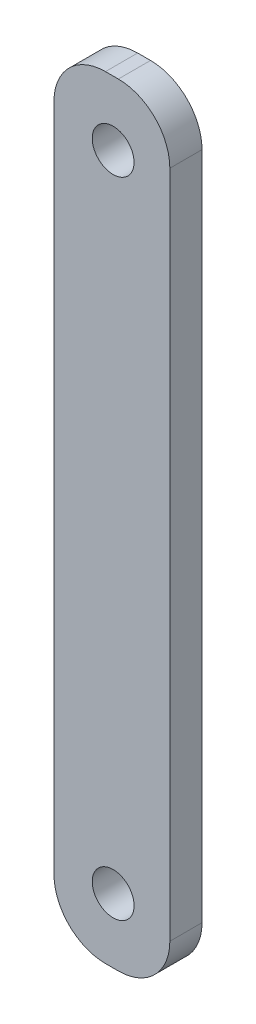
ISO-10303-21;
HEADER;
FILE_DESCRIPTION(('STEP AP214'),'2;1');
FILE_NAME('part.step','',(''),(''),'','','');
FILE_SCHEMA(('AUTOMOTIVE_DESIGN { 1 0 10303 214 1 1 1 1 }'));
ENDSEC;
DATA;
#1=APPLICATION_CONTEXT('core data for automotive mechanical design processes');
#2=APPLICATION_PROTOCOL_DEFINITION('international standard','automotive_design',2000,#1);
#3=PRODUCT_CONTEXT('',#1,'mechanical');
#4=PRODUCT('Part','Part','',(#3));
#5=PRODUCT_RELATED_PRODUCT_CATEGORY('part','',(#4));
#6=PRODUCT_DEFINITION_FORMATION('','',#4);
#7=PRODUCT_DEFINITION_CONTEXT('part definition',#1,'design');
#8=PRODUCT_DEFINITION('design','',#6,#7);
#9=PRODUCT_DEFINITION_SHAPE('','',#8);
#10=(LENGTH_UNIT() NAMED_UNIT(*) SI_UNIT(.MILLI.,.METRE.));
#11=(NAMED_UNIT(*) PLANE_ANGLE_UNIT() SI_UNIT($,.RADIAN.));
#12=(NAMED_UNIT(*) SI_UNIT($,.STERADIAN.) SOLID_ANGLE_UNIT());
#13=UNCERTAINTY_MEASURE_WITH_UNIT(LENGTH_MEASURE(1.E-05),#10,'distance_accuracy_value','');
#14=(GEOMETRIC_REPRESENTATION_CONTEXT(3) GLOBAL_UNCERTAINTY_ASSIGNED_CONTEXT((#13)) GLOBAL_UNIT_ASSIGNED_CONTEXT((#10,
#11,#12)) REPRESENTATION_CONTEXT('',''));
#15=CARTESIAN_POINT('',(0.,0.,0.));
#16=DIRECTION('',(0.,0.,1.));
#17=DIRECTION('',(1.,0.,0.));
#18=AXIS2_PLACEMENT_3D('',#15,#16,#17);
#19=CARTESIAN_POINT('',(-9.19325153374236,110.955788215749,5.));
#20=DIRECTION('',(0.,1.,0.));
#21=DIRECTION('',(0.,0.,1.));
#22=AXIS2_PLACEMENT_3D('',#19,#20,#21);
#23=PLANE('',#22);
#24=DIRECTION('',(1.,0.,0.));
#25=VECTOR('',#24,1.);
#26=CARTESIAN_POINT('',(-9.19325153374236,110.955788215749,0.));
#27=LINE('',#26,#25);
#28=CARTESIAN_POINT('',(-1.19325153374236,110.955788215749,0.));
#29=VERTEX_POINT('',#28);
#30=CARTESIAN_POINT('',(0.806748466257638,110.955788215749,0.));
#31=VERTEX_POINT('',#30);
#32=EDGE_CURVE('E135',#29,#31,#27,.T.);
#33=ORIENTED_EDGE('',*,*,#32,.F.);
#34=DIRECTION('',(0.,0.,-1.));
#35=VECTOR('',#34,1.);
#36=CARTESIAN_POINT('',(-1.19325153374236,110.955788215749,5.));
#37=LINE('',#36,#35);
#38=CARTESIAN_POINT('',(-1.19325153374236,110.955788215749,5.));
#39=VERTEX_POINT('',#38);
#40=EDGE_CURVE('E11',#29,#39,#37,.F.);
#41=ORIENTED_EDGE('',*,*,#40,.T.);
#42=DIRECTION('',(1.,0.,0.));
#43=VECTOR('',#42,1.);
#44=CARTESIAN_POINT('',(-9.19325153374236,110.955788215749,5.));
#45=LINE('',#44,#43);
#46=CARTESIAN_POINT('',(0.806748466257638,110.955788215749,5.));
#47=VERTEX_POINT('',#46);
#48=EDGE_CURVE('E133',#39,#47,#45,.T.);
#49=ORIENTED_EDGE('',*,*,#48,.T.);
#50=DIRECTION('',(0.,0.,-1.));
#51=VECTOR('',#50,1.);
#52=CARTESIAN_POINT('',(0.806748466257638,110.955788215749,5.));
#53=LINE('',#52,#51);
#54=EDGE_CURVE('E47',#47,#31,#53,.T.);
#55=ORIENTED_EDGE('',*,*,#54,.T.);
#56=EDGE_LOOP('',(#33,#41,#49,#55));
#57=FACE_BOUND('',#56,.T.);
#58=ADVANCED_FACE('F39',(#57),#23,.T.);
#59=CARTESIAN_POINT('',(-9.19325153374236,110.955788215749,5.));
#60=DIRECTION('',(1.,0.,0.));
#61=DIRECTION('',(0.,1.,0.));
#62=AXIS2_PLACEMENT_3D('',#59,#60,#61);
#63=PLANE('',#62);
#64=DIRECTION('',(0.,-1.,0.));
#65=VECTOR('',#64,1.);
#66=CARTESIAN_POINT('',(-9.19325153374236,110.955788215749,0.));
#67=LINE('',#66,#65);
#68=CARTESIAN_POINT('',(-9.19325153374236,102.955788215749,0.));
#69=VERTEX_POINT('',#68);
#70=CARTESIAN_POINT('',(-9.19325153374235,-1.04421178425126,0.));
#71=VERTEX_POINT('',#70);
#72=EDGE_CURVE('E130',#69,#71,#67,.T.);
#73=ORIENTED_EDGE('',*,*,#72,.T.);
#74=DIRECTION('',(0.,0.,-1.));
#75=VECTOR('',#74,1.);
#76=CARTESIAN_POINT('',(-9.19325153374235,-1.04421178425126,5.));
#77=LINE('',#76,#75);
#78=CARTESIAN_POINT('',(-9.19325153374235,-1.04421178425126,5.));
#79=VERTEX_POINT('',#78);
#80=EDGE_CURVE('E110',#71,#79,#77,.F.);
#81=ORIENTED_EDGE('',*,*,#80,.T.);
#82=DIRECTION('',(0.,-1.,0.));
#83=VECTOR('',#82,1.);
#84=CARTESIAN_POINT('',(-9.19325153374236,110.955788215749,5.));
#85=LINE('',#84,#83);
#86=CARTESIAN_POINT('',(-9.19325153374236,102.955788215749,5.));
#87=VERTEX_POINT('',#86);
#88=EDGE_CURVE('E146',#87,#79,#85,.T.);
#89=ORIENTED_EDGE('',*,*,#88,.F.);
#90=DIRECTION('',(0.,0.,-1.));
#91=VECTOR('',#90,1.);
#92=CARTESIAN_POINT('',(-9.19325153374236,102.955788215749,0.));
#93=LINE('',#92,#91);
#94=EDGE_CURVE('E115',#87,#69,#93,.T.);
#95=ORIENTED_EDGE('',*,*,#94,.T.);
#96=EDGE_LOOP('',(#73,#81,#89,#95));
#97=FACE_BOUND('',#96,.T.);
#98=ADVANCED_FACE('F200',(#97),#63,.F.);
#99=CARTESIAN_POINT('',(-9.19325153374235,-9.04421178425126,5.));
#100=DIRECTION('',(0.,1.,0.));
#101=DIRECTION('',(0.,0.,1.));
#102=AXIS2_PLACEMENT_3D('',#99,#100,#101);
#103=PLANE('',#102);
#104=DIRECTION('',(1.,0.,0.));
#105=VECTOR('',#104,1.);
#106=CARTESIAN_POINT('',(-9.19325153374235,-9.04421178425126,5.));
#107=LINE('',#106,#105);
#108=CARTESIAN_POINT('',(-1.19325153374235,-9.04421178425126,5.));
#109=VERTEX_POINT('',#108);
#110=CARTESIAN_POINT('',(0.806748466257652,-9.04421178425126,5.));
#111=VERTEX_POINT('',#110);
#112=EDGE_CURVE('E124',#109,#111,#107,.T.);
#113=ORIENTED_EDGE('',*,*,#112,.F.);
#114=DIRECTION('',(0.,0.,-1.));
#115=VECTOR('',#114,1.);
#116=CARTESIAN_POINT('',(-1.19325153374235,-9.04421178425126,5.));
#117=LINE('',#116,#115);
#118=CARTESIAN_POINT('',(-1.19325153374235,-9.04421178425126,0.));
#119=VERTEX_POINT('',#118);
#120=EDGE_CURVE('E109',#109,#119,#117,.T.);
#121=ORIENTED_EDGE('',*,*,#120,.T.);
#122=DIRECTION('',(1.,0.,0.));
#123=VECTOR('',#122,1.);
#124=CARTESIAN_POINT('',(-9.19325153374235,-9.04421178425126,0.));
#125=LINE('',#124,#123);
#126=CARTESIAN_POINT('',(0.806748466257652,-9.04421178425126,0.));
#127=VERTEX_POINT('',#126);
#128=EDGE_CURVE('E122',#119,#127,#125,.T.);
#129=ORIENTED_EDGE('',*,*,#128,.T.);
#130=DIRECTION('',(0.,0.,-1.));
#131=VECTOR('',#130,1.);
#132=CARTESIAN_POINT('',(0.806748466257652,-9.04421178425126,5.));
#133=LINE('',#132,#131);
#134=EDGE_CURVE('E126',#127,#111,#133,.F.);
#135=ORIENTED_EDGE('',*,*,#134,.T.);
#136=EDGE_LOOP('',(#113,#121,#129,#135));
#137=FACE_BOUND('',#136,.T.);
#138=ADVANCED_FACE('F121',(#137),#103,.F.);
#139=CARTESIAN_POINT('',(8.80674846625764,110.955788215749,5.));
#140=DIRECTION('',(1.,0.,0.));
#141=DIRECTION('',(0.,1.,0.));
#142=AXIS2_PLACEMENT_3D('',#139,#140,#141);
#143=PLANE('',#142);
#144=DIRECTION('',(0.,-1.,0.));
#145=VECTOR('',#144,1.);
#146=CARTESIAN_POINT('',(8.80674846625764,110.955788215749,5.));
#147=LINE('',#146,#145);
#148=CARTESIAN_POINT('',(8.80674846625764,102.955788215749,5.));
#149=VERTEX_POINT('',#148);
#150=CARTESIAN_POINT('',(8.80674846625765,-1.04421178425125,5.));
#151=VERTEX_POINT('',#150);
#152=EDGE_CURVE('E179',#149,#151,#147,.T.);
#153=ORIENTED_EDGE('',*,*,#152,.T.);
#154=DIRECTION('',(0.,0.,-1.));
#155=VECTOR('',#154,1.);
#156=CARTESIAN_POINT('',(8.80674846625765,-1.04421178425125,0.));
#157=LINE('',#156,#155);
#158=CARTESIAN_POINT('',(8.80674846625765,-1.04421178425125,0.));
#159=VERTEX_POINT('',#158);
#160=EDGE_CURVE('E163',#151,#159,#157,.T.);
#161=ORIENTED_EDGE('',*,*,#160,.T.);
#162=DIRECTION('',(0.,-1.,0.));
#163=VECTOR('',#162,1.);
#164=CARTESIAN_POINT('',(8.80674846625764,110.955788215749,0.));
#165=LINE('',#164,#163);
#166=CARTESIAN_POINT('',(8.80674846625764,102.955788215749,0.));
#167=VERTEX_POINT('',#166);
#168=EDGE_CURVE('E131',#167,#159,#165,.T.);
#169=ORIENTED_EDGE('',*,*,#168,.F.);
#170=DIRECTION('',(0.,0.,-1.));
#171=VECTOR('',#170,1.);
#172=CARTESIAN_POINT('',(8.80674846625764,102.955788215749,5.));
#173=LINE('',#172,#171);
#174=EDGE_CURVE('E61',#167,#149,#173,.F.);
#175=ORIENTED_EDGE('',*,*,#174,.T.);
#176=EDGE_LOOP('',(#153,#161,#169,#175));
#177=FACE_BOUND('',#176,.T.);
#178=ADVANCED_FACE('F193',(#177),#143,.T.);
#179=CARTESIAN_POINT('',(0.,0.,5.));
#180=DIRECTION('',(0.,0.,-1.));
#181=DIRECTION('',(-1.,0.,0.));
#182=AXIS2_PLACEMENT_3D('',#179,#180,#181);
#183=PLANE('',#182);
#184=CARTESIAN_POINT('',(0.,0.955788215748743,5.));
#185=DIRECTION('',(0.,0.,1.));
#186=DIRECTION('',(1.,0.,0.));
#187=AXIS2_PLACEMENT_3D('',#184,#185,#186);
#188=CIRCLE('',#187,3.25);
#189=CARTESIAN_POINT('',(3.25,0.955788215748743,5.));
#190=VERTEX_POINT('',#189);
#191=EDGE_CURVE('E143',#190,#190,#188,.T.);
#192=ORIENTED_EDGE('',*,*,#191,.F.);
#193=EDGE_LOOP('',(#192));
#194=FACE_BOUND('',#193,.T.);
#195=CARTESIAN_POINT('',(0.,100.955788215749,5.));
#196=DIRECTION('',(0.,0.,1.));
#197=DIRECTION('',(1.,0.,0.));
#198=AXIS2_PLACEMENT_3D('',#195,#196,#197);
#199=CIRCLE('',#198,3.25);
#200=CARTESIAN_POINT('',(3.25,100.955788215749,5.));
#201=VERTEX_POINT('',#200);
#202=EDGE_CURVE('E182',#201,#201,#199,.T.);
#203=ORIENTED_EDGE('',*,*,#202,.F.);
#204=EDGE_LOOP('',(#203));
#205=FACE_BOUND('',#204,.T.);
#206=ORIENTED_EDGE('',*,*,#88,.T.);
#207=CARTESIAN_POINT('',(-1.19325153374235,-1.04421178425126,5.));
#208=DIRECTION('',(0.,0.,-1.));
#209=DIRECTION('',(-1.,0.,0.));
#210=AXIS2_PLACEMENT_3D('',#207,#208,#209);
#211=CIRCLE('',#210,8.);
#212=EDGE_CURVE('E160',#79,#109,#211,.F.);
#213=ORIENTED_EDGE('',*,*,#212,.T.);
#214=ORIENTED_EDGE('',*,*,#112,.T.);
#215=CARTESIAN_POINT('',(0.806748466257652,-1.04421178425125,5.));
#216=DIRECTION('',(0.,0.,-1.));
#217=DIRECTION('',(-1.,0.,0.));
#218=AXIS2_PLACEMENT_3D('',#215,#216,#217);
#219=CIRCLE('',#218,8.);
#220=EDGE_CURVE('E54',#111,#151,#219,.F.);
#221=ORIENTED_EDGE('',*,*,#220,.T.);
#222=ORIENTED_EDGE('',*,*,#152,.F.);
#223=CARTESIAN_POINT('',(0.806748466257638,102.955788215749,5.));
#224=DIRECTION('',(0.,0.,-1.));
#225=DIRECTION('',(-1.,0.,0.));
#226=AXIS2_PLACEMENT_3D('',#223,#224,#225);
#227=CIRCLE('',#226,8.);
#228=EDGE_CURVE('E155',#149,#47,#227,.F.);
#229=ORIENTED_EDGE('',*,*,#228,.T.);
#230=ORIENTED_EDGE('',*,*,#48,.F.);
#231=CARTESIAN_POINT('',(-1.19325153374236,102.955788215749,5.));
#232=DIRECTION('',(0.,0.,-1.));
#233=DIRECTION('',(-1.,0.,0.));
#234=AXIS2_PLACEMENT_3D('',#231,#232,#233);
#235=CIRCLE('',#234,8.);
#236=EDGE_CURVE('E157',#39,#87,#235,.F.);
#237=ORIENTED_EDGE('',*,*,#236,.T.);
#238=EDGE_LOOP('',(#206,#213,#214,#221,#222,#229,#230,#237));
#239=FACE_BOUND('',#238,.T.);
#240=ADVANCED_FACE('F190',(#194,#205,#239),#183,.F.);
#241=CARTESIAN_POINT('',(0.,0.,0.));
#242=DIRECTION('',(0.,0.,-1.));
#243=DIRECTION('',(-1.,0.,0.));
#244=AXIS2_PLACEMENT_3D('',#241,#242,#243);
#245=PLANE('',#244);
#246=CARTESIAN_POINT('',(0.,0.955788215748743,0.));
#247=DIRECTION('',(0.,0.,-1.));
#248=DIRECTION('',(-1.,0.,0.));
#249=AXIS2_PLACEMENT_3D('',#246,#247,#248);
#250=CIRCLE('',#249,3.25);
#251=CARTESIAN_POINT('',(-3.25,0.955788215748743,0.));
#252=VERTEX_POINT('',#251);
#253=EDGE_CURVE('E142',#252,#252,#250,.T.);
#254=ORIENTED_EDGE('',*,*,#253,.F.);
#255=EDGE_LOOP('',(#254));
#256=FACE_BOUND('',#255,.T.);
#257=CARTESIAN_POINT('',(0.,100.955788215749,0.));
#258=DIRECTION('',(0.,0.,-1.));
#259=DIRECTION('',(-1.,0.,0.));
#260=AXIS2_PLACEMENT_3D('',#257,#258,#259);
#261=CIRCLE('',#260,3.25);
#262=CARTESIAN_POINT('',(-3.25,100.955788215749,0.));
#263=VERTEX_POINT('',#262);
#264=EDGE_CURVE('E139',#263,#263,#261,.T.);
#265=ORIENTED_EDGE('',*,*,#264,.F.);
#266=EDGE_LOOP('',(#265));
#267=FACE_BOUND('',#266,.T.);
#268=ORIENTED_EDGE('',*,*,#128,.F.);
#269=CARTESIAN_POINT('',(-1.19325153374235,-1.04421178425126,0.));
#270=DIRECTION('',(0.,0.,-1.));
#271=DIRECTION('',(-1.,0.,0.));
#272=AXIS2_PLACEMENT_3D('',#269,#270,#271);
#273=CIRCLE('',#272,8.);
#274=EDGE_CURVE('E105',#119,#71,#273,.T.);
#275=ORIENTED_EDGE('',*,*,#274,.T.);
#276=ORIENTED_EDGE('',*,*,#72,.F.);
#277=CARTESIAN_POINT('',(-1.19325153374236,102.955788215749,0.));
#278=DIRECTION('',(0.,0.,-1.));
#279=DIRECTION('',(-1.,0.,0.));
#280=AXIS2_PLACEMENT_3D('',#277,#278,#279);
#281=CIRCLE('',#280,8.);
#282=EDGE_CURVE('E149',#69,#29,#281,.T.);
#283=ORIENTED_EDGE('',*,*,#282,.T.);
#284=ORIENTED_EDGE('',*,*,#32,.T.);
#285=CARTESIAN_POINT('',(0.806748466257638,102.955788215749,0.));
#286=DIRECTION('',(0.,0.,-1.));
#287=DIRECTION('',(-1.,0.,0.));
#288=AXIS2_PLACEMENT_3D('',#285,#286,#287);
#289=CIRCLE('',#288,8.);
#290=EDGE_CURVE('E125',#31,#167,#289,.T.);
#291=ORIENTED_EDGE('',*,*,#290,.T.);
#292=ORIENTED_EDGE('',*,*,#168,.T.);
#293=CARTESIAN_POINT('',(0.806748466257652,-1.04421178425125,0.));
#294=DIRECTION('',(0.,0.,-1.));
#295=DIRECTION('',(-1.,0.,0.));
#296=AXIS2_PLACEMENT_3D('',#293,#294,#295);
#297=CIRCLE('',#296,8.);
#298=EDGE_CURVE('E116',#159,#127,#297,.T.);
#299=ORIENTED_EDGE('',*,*,#298,.T.);
#300=EDGE_LOOP('',(#268,#275,#276,#283,#284,#291,#292,#299));
#301=FACE_BOUND('',#300,.T.);
#302=ADVANCED_FACE('F128',(#256,#267,#301),#245,.T.);
#303=CARTESIAN_POINT('',(0.,100.955788215749,-25.));
#304=DIRECTION('',(0.,0.,1.));
#305=DIRECTION('',(1.,0.,0.));
#306=AXIS2_PLACEMENT_3D('',#303,#304,#305);
#307=CYLINDRICAL_SURFACE('',#306,3.25);
#308=ORIENTED_EDGE('',*,*,#264,.T.);
#309=EDGE_LOOP('',(#308));
#310=FACE_BOUND('',#309,.T.);
#311=ORIENTED_EDGE('',*,*,#202,.T.);
#312=EDGE_LOOP('',(#311));
#313=FACE_BOUND('',#312,.T.);
#314=ADVANCED_FACE('F233',(#310,#313),#307,.F.);
#315=CARTESIAN_POINT('',(0.,0.955788215748743,-25.));
#316=DIRECTION('',(0.,0.,1.));
#317=DIRECTION('',(1.,0.,0.));
#318=AXIS2_PLACEMENT_3D('',#315,#316,#317);
#319=CYLINDRICAL_SURFACE('',#318,3.25);
#320=ORIENTED_EDGE('',*,*,#253,.T.);
#321=EDGE_LOOP('',(#320));
#322=FACE_BOUND('',#321,.T.);
#323=ORIENTED_EDGE('',*,*,#191,.T.);
#324=EDGE_LOOP('',(#323));
#325=FACE_BOUND('',#324,.T.);
#326=ADVANCED_FACE('F188',(#322,#325),#319,.F.);
#327=CARTESIAN_POINT('',(-1.19325153374235,-1.04421178425126,5.));
#328=DIRECTION('',(0.,0.,-1.));
#329=DIRECTION('',(-1.,0.,0.));
#330=AXIS2_PLACEMENT_3D('',#327,#328,#329);
#331=CYLINDRICAL_SURFACE('',#330,8.);
#332=ORIENTED_EDGE('',*,*,#212,.F.);
#333=ORIENTED_EDGE('',*,*,#80,.F.);
#334=ORIENTED_EDGE('',*,*,#274,.F.);
#335=ORIENTED_EDGE('',*,*,#120,.F.);
#336=EDGE_LOOP('',(#332,#333,#334,#335));
#337=FACE_BOUND('',#336,.T.);
#338=ADVANCED_FACE('F108',(#337),#331,.T.);
#339=CARTESIAN_POINT('',(0.806748466257652,-1.04421178425125,5.));
#340=DIRECTION('',(0.,0.,1.));
#341=DIRECTION('',(1.,0.,0.));
#342=AXIS2_PLACEMENT_3D('',#339,#340,#341);
#343=CYLINDRICAL_SURFACE('',#342,8.);
#344=ORIENTED_EDGE('',*,*,#220,.F.);
#345=ORIENTED_EDGE('',*,*,#134,.F.);
#346=ORIENTED_EDGE('',*,*,#298,.F.);
#347=ORIENTED_EDGE('',*,*,#160,.F.);
#348=EDGE_LOOP('',(#344,#345,#346,#347));
#349=FACE_BOUND('',#348,.T.);
#350=ADVANCED_FACE('F207',(#349),#343,.T.);
#351=CARTESIAN_POINT('',(-1.19325153374236,102.955788215749,5.));
#352=DIRECTION('',(0.,0.,1.));
#353=DIRECTION('',(1.,0.,0.));
#354=AXIS2_PLACEMENT_3D('',#351,#352,#353);
#355=CYLINDRICAL_SURFACE('',#354,8.);
#356=ORIENTED_EDGE('',*,*,#236,.F.);
#357=ORIENTED_EDGE('',*,*,#40,.F.);
#358=ORIENTED_EDGE('',*,*,#282,.F.);
#359=ORIENTED_EDGE('',*,*,#94,.F.);
#360=EDGE_LOOP('',(#356,#357,#358,#359));
#361=FACE_BOUND('',#360,.T.);
#362=ADVANCED_FACE('F202',(#361),#355,.T.);
#363=CARTESIAN_POINT('',(0.806748466257638,102.955788215749,5.));
#364=DIRECTION('',(0.,0.,-1.));
#365=DIRECTION('',(-1.,0.,0.));
#366=AXIS2_PLACEMENT_3D('',#363,#364,#365);
#367=CYLINDRICAL_SURFACE('',#366,8.);
#368=ORIENTED_EDGE('',*,*,#228,.F.);
#369=ORIENTED_EDGE('',*,*,#174,.F.);
#370=ORIENTED_EDGE('',*,*,#290,.F.);
#371=ORIENTED_EDGE('',*,*,#54,.F.);
#372=EDGE_LOOP('',(#368,#369,#370,#371));
#373=FACE_BOUND('',#372,.T.);
#374=ADVANCED_FACE('F41',(#373),#367,.T.);
#375=CLOSED_SHELL('',(#58,#98,#138,#178,#240,#302,#314,#326,#338,#350,#362,#374));
#376=MANIFOLD_SOLID_BREP('B2',#375);
#377=ADVANCED_BREP_SHAPE_REPRESENTATION('',(#18,#376),#14);
#378=SHAPE_DEFINITION_REPRESENTATION(#9,#377);
ENDSEC;
END-ISO-10303-21;
